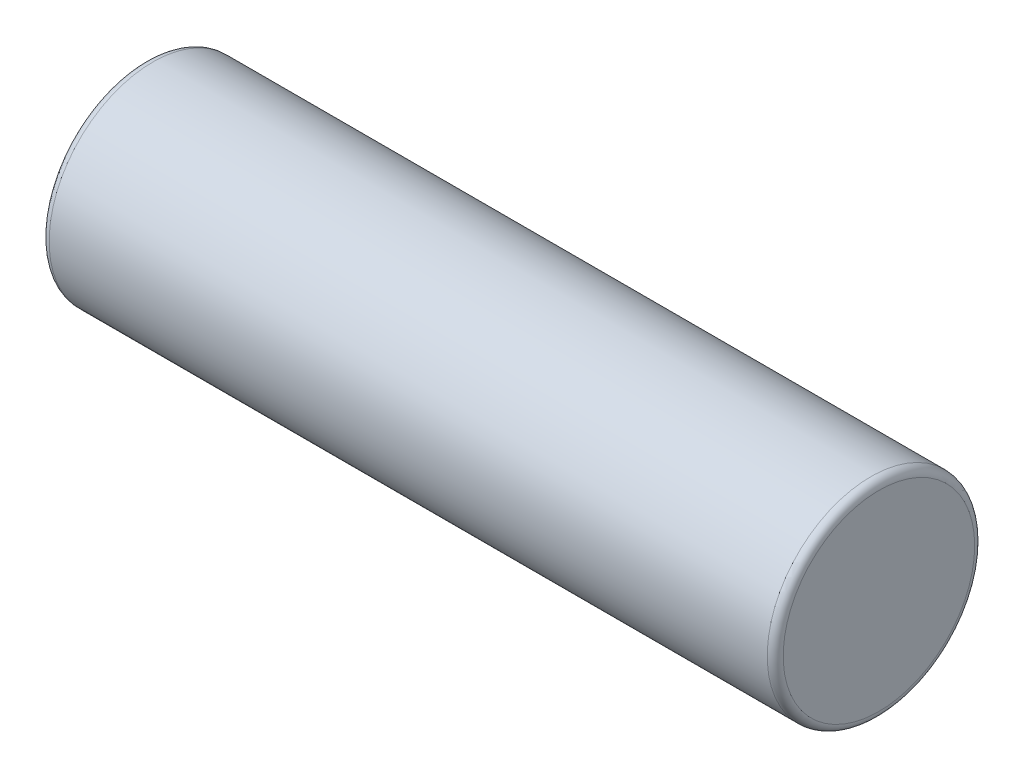
ISO-10303-21;
HEADER;
FILE_DESCRIPTION(('STEP AP214'),'2;1');
FILE_NAME('part.step','',(''),(''),'','','');
FILE_SCHEMA(('AUTOMOTIVE_DESIGN { 1 0 10303 214 1 1 1 1 }'));
ENDSEC;
DATA;
#1=APPLICATION_CONTEXT('core data for automotive mechanical design processes');
#2=APPLICATION_PROTOCOL_DEFINITION('international standard','automotive_design',2000,#1);
#3=PRODUCT_CONTEXT('',#1,'mechanical');
#4=PRODUCT('Part','Part','',(#3));
#5=PRODUCT_RELATED_PRODUCT_CATEGORY('part','',(#4));
#6=PRODUCT_DEFINITION_FORMATION('','',#4);
#7=PRODUCT_DEFINITION_CONTEXT('part definition',#1,'design');
#8=PRODUCT_DEFINITION('design','',#6,#7);
#9=PRODUCT_DEFINITION_SHAPE('','',#8);
#10=(LENGTH_UNIT() NAMED_UNIT(*) SI_UNIT(.MILLI.,.METRE.));
#11=(NAMED_UNIT(*) PLANE_ANGLE_UNIT() SI_UNIT($,.RADIAN.));
#12=(NAMED_UNIT(*) SI_UNIT($,.STERADIAN.) SOLID_ANGLE_UNIT());
#13=UNCERTAINTY_MEASURE_WITH_UNIT(LENGTH_MEASURE(1.E-05),#10,'distance_accuracy_value','');
#14=(GEOMETRIC_REPRESENTATION_CONTEXT(3) GLOBAL_UNCERTAINTY_ASSIGNED_CONTEXT((#13)) GLOBAL_UNIT_ASSIGNED_CONTEXT((#10,
#11,#12)) REPRESENTATION_CONTEXT('',''));
#15=CARTESIAN_POINT('',(0.,0.,0.));
#16=DIRECTION('',(0.,0.,1.));
#17=DIRECTION('',(1.,0.,0.));
#18=AXIS2_PLACEMENT_3D('',#15,#16,#17);
#19=CARTESIAN_POINT('',(46.,0.,0.));
#20=DIRECTION('',(-1.,0.,0.));
#21=DIRECTION('',(0.,0.,1.));
#22=AXIS2_PLACEMENT_3D('',#19,#20,#21);
#23=CYLINDRICAL_SURFACE('',#22,6.5);
#24=CARTESIAN_POINT('',(45.5,0.,0.));
#25=DIRECTION('',(1.,0.,0.));
#26=DIRECTION('',(0.,0.,-1.));
#27=AXIS2_PLACEMENT_3D('',#24,#25,#26);
#28=CIRCLE('',#27,6.5);
#29=CARTESIAN_POINT('',(45.5,0.,-6.5));
#30=VERTEX_POINT('',#29);
#31=EDGE_CURVE('E38',#30,#30,#28,.F.);
#32=ORIENTED_EDGE('',*,*,#31,.T.);
#33=EDGE_LOOP('',(#32));
#34=FACE_BOUND('',#33,.T.);
#35=CARTESIAN_POINT('',(0.5,0.,0.));
#36=DIRECTION('',(1.,0.,0.));
#37=DIRECTION('',(0.,0.,-1.));
#38=AXIS2_PLACEMENT_3D('',#35,#36,#37);
#39=CIRCLE('',#38,6.5);
#40=CARTESIAN_POINT('',(0.5,0.,-6.5));
#41=VERTEX_POINT('',#40);
#42=EDGE_CURVE('E42',#41,#41,#39,.T.);
#43=ORIENTED_EDGE('',*,*,#42,.T.);
#44=EDGE_LOOP('',(#43));
#45=FACE_BOUND('',#44,.T.);
#46=ADVANCED_FACE('F31',(#34,#45),#23,.T.);
#47=CARTESIAN_POINT('',(46.,0.,0.));
#48=DIRECTION('',(1.,0.,0.));
#49=DIRECTION('',(0.,0.,-1.));
#50=AXIS2_PLACEMENT_3D('',#47,#48,#49);
#51=PLANE('',#50);
#52=CARTESIAN_POINT('',(46.,0.,0.));
#53=DIRECTION('',(1.,0.,0.));
#54=DIRECTION('',(0.,0.,-1.));
#55=AXIS2_PLACEMENT_3D('',#52,#53,#54);
#56=CIRCLE('',#55,6.);
#57=CARTESIAN_POINT('',(46.,0.,-6.));
#58=VERTEX_POINT('',#57);
#59=EDGE_CURVE('E46',#58,#58,#56,.T.);
#60=ORIENTED_EDGE('',*,*,#59,.T.);
#61=EDGE_LOOP('',(#60));
#62=FACE_BOUND('',#61,.T.);
#63=ADVANCED_FACE('F52',(#62),#51,.T.);
#64=CARTESIAN_POINT('',(0.,0.,0.));
#65=DIRECTION('',(1.,0.,0.));
#66=DIRECTION('',(0.,0.,-1.));
#67=AXIS2_PLACEMENT_3D('',#64,#65,#66);
#68=PLANE('',#67);
#69=CARTESIAN_POINT('',(0.,0.,0.));
#70=DIRECTION('',(1.,0.,0.));
#71=DIRECTION('',(0.,0.,-1.));
#72=AXIS2_PLACEMENT_3D('',#69,#70,#71);
#73=CIRCLE('',#72,6.);
#74=CARTESIAN_POINT('',(0.,0.,-6.));
#75=VERTEX_POINT('',#74);
#76=EDGE_CURVE('E10',#75,#75,#73,.F.);
#77=ORIENTED_EDGE('',*,*,#76,.T.);
#78=EDGE_LOOP('',(#77));
#79=FACE_BOUND('',#78,.T.);
#80=ADVANCED_FACE('F56',(#79),#68,.F.);
#81=CARTESIAN_POINT('',(45.5,0.,0.));
#82=DIRECTION('',(1.,0.,0.));
#83=DIRECTION('',(0.,0.,-1.));
#84=AXIS2_PLACEMENT_3D('',#81,#82,#83);
#85=TOROIDAL_SURFACE('',#84,6.,0.5);
#86=ORIENTED_EDGE('',*,*,#31,.F.);
#87=EDGE_LOOP('',(#86));
#88=FACE_BOUND('',#87,.T.);
#89=ORIENTED_EDGE('',*,*,#59,.F.);
#90=EDGE_LOOP('',(#89));
#91=FACE_BOUND('',#90,.T.);
#92=ADVANCED_FACE('F54',(#88,#91),#85,.T.);
#93=CARTESIAN_POINT('',(0.5,0.,0.));
#94=DIRECTION('',(1.,0.,0.));
#95=DIRECTION('',(0.,0.,-1.));
#96=AXIS2_PLACEMENT_3D('',#93,#94,#95);
#97=TOROIDAL_SURFACE('',#96,6.,0.5);
#98=ORIENTED_EDGE('',*,*,#76,.F.);
#99=EDGE_LOOP('',(#98));
#100=FACE_BOUND('',#99,.T.);
#101=ORIENTED_EDGE('',*,*,#42,.F.);
#102=EDGE_LOOP('',(#101));
#103=FACE_BOUND('',#102,.T.);
#104=ADVANCED_FACE('F33',(#100,#103),#97,.T.);
#105=CLOSED_SHELL('',(#46,#63,#80,#92,#104));
#106=MANIFOLD_SOLID_BREP('B2',#105);
#107=ADVANCED_BREP_SHAPE_REPRESENTATION('',(#18,#106),#14);
#108=SHAPE_DEFINITION_REPRESENTATION(#9,#107);
ENDSEC;
END-ISO-10303-21;
